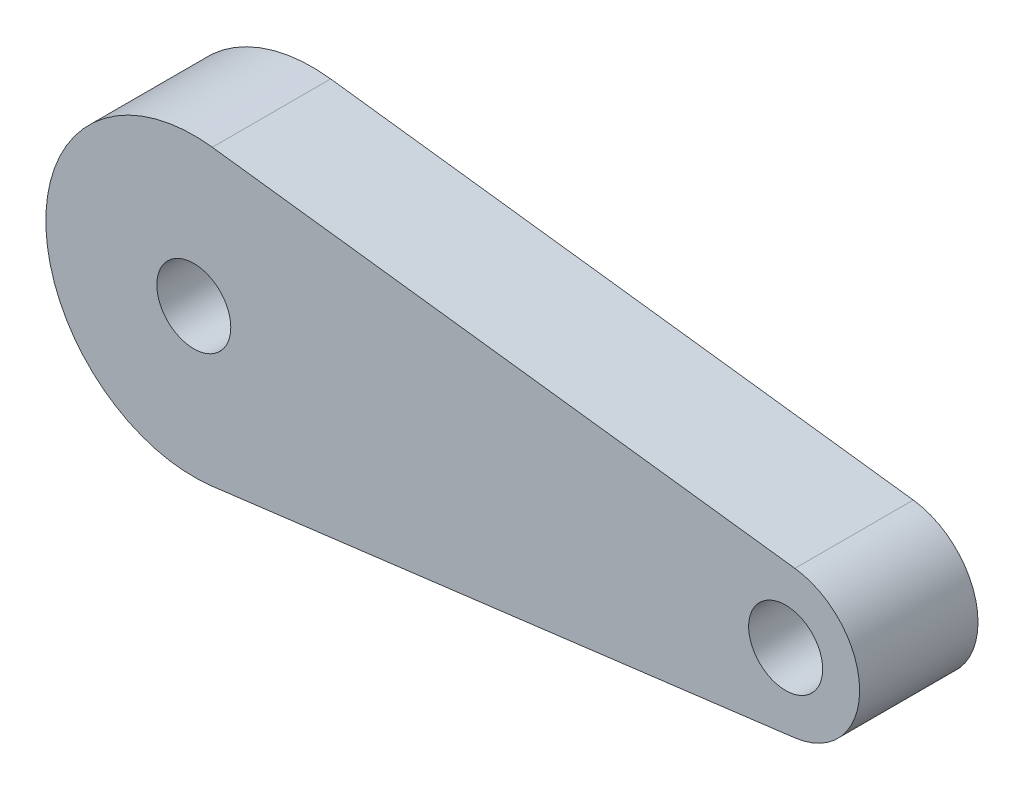
ISO-10303-21;
HEADER;
FILE_DESCRIPTION(('STEP AP214'),'2;1');
FILE_NAME('part.step','',(''),(''),'','','');
FILE_SCHEMA(('AUTOMOTIVE_DESIGN { 1 0 10303 214 1 1 1 1 }'));
ENDSEC;
DATA;
#1=APPLICATION_CONTEXT('core data for automotive mechanical design processes');
#2=APPLICATION_PROTOCOL_DEFINITION('international standard','automotive_design',2000,#1);
#3=PRODUCT_CONTEXT('',#1,'mechanical');
#4=PRODUCT('Part','Part','',(#3));
#5=PRODUCT_RELATED_PRODUCT_CATEGORY('part','',(#4));
#6=PRODUCT_DEFINITION_FORMATION('','',#4);
#7=PRODUCT_DEFINITION_CONTEXT('part definition',#1,'design');
#8=PRODUCT_DEFINITION('design','',#6,#7);
#9=PRODUCT_DEFINITION_SHAPE('','',#8);
#10=(LENGTH_UNIT() NAMED_UNIT(*) SI_UNIT(.MILLI.,.METRE.));
#11=(NAMED_UNIT(*) PLANE_ANGLE_UNIT() SI_UNIT($,.RADIAN.));
#12=(NAMED_UNIT(*) SI_UNIT($,.STERADIAN.) SOLID_ANGLE_UNIT());
#13=UNCERTAINTY_MEASURE_WITH_UNIT(LENGTH_MEASURE(1.E-05),#10,'distance_accuracy_value','');
#14=(GEOMETRIC_REPRESENTATION_CONTEXT(3) GLOBAL_UNCERTAINTY_ASSIGNED_CONTEXT((#13)) GLOBAL_UNIT_ASSIGNED_CONTEXT((#10,
#11,#12)) REPRESENTATION_CONTEXT('',''));
#15=CARTESIAN_POINT('',(0.,0.,0.));
#16=DIRECTION('',(0.,0.,1.));
#17=DIRECTION('',(1.,0.,0.));
#18=AXIS2_PLACEMENT_3D('',#15,#16,#17);
#19=CARTESIAN_POINT('',(1.25,-9.92156741649222,8.));
#20=DIRECTION('',(-0.125,0.992156741649222,0.));
#21=DIRECTION('',(-0.992156741649222,-0.125,0.));
#22=AXIS2_PLACEMENT_3D('',#19,#20,#21);
#23=PLANE('',#22);
#24=DIRECTION('',(0.992156741649222,0.125,0.));
#25=VECTOR('',#24,1.);
#26=CARTESIAN_POINT('',(1.25,-9.92156741649222,0.));
#27=LINE('',#26,#25);
#28=CARTESIAN_POINT('',(1.25,-9.92156741649221,0.));
#29=VERTEX_POINT('',#28);
#30=CARTESIAN_POINT('',(40.625,-4.96078370824611,0.));
#31=VERTEX_POINT('',#30);
#32=EDGE_CURVE('E113',#29,#31,#27,.T.);
#33=ORIENTED_EDGE('',*,*,#32,.T.);
#34=DIRECTION('',(0.,0.,-1.));
#35=VECTOR('',#34,1.);
#36=CARTESIAN_POINT('',(40.625,-4.96078370824611,8.));
#37=LINE('',#36,#35);
#38=CARTESIAN_POINT('',(40.625,-4.96078370824611,8.));
#39=VERTEX_POINT('',#38);
#40=EDGE_CURVE('E11',#39,#31,#37,.T.);
#41=ORIENTED_EDGE('',*,*,#40,.F.);
#42=DIRECTION('',(0.992156741649222,0.125,0.));
#43=VECTOR('',#42,1.);
#44=CARTESIAN_POINT('',(1.25,-9.92156741649222,8.));
#45=LINE('',#44,#43);
#46=CARTESIAN_POINT('',(1.25,-9.92156741649221,8.));
#47=VERTEX_POINT('',#46);
#48=EDGE_CURVE('E92',#47,#39,#45,.T.);
#49=ORIENTED_EDGE('',*,*,#48,.F.);
#50=DIRECTION('',(0.,0.,-1.));
#51=VECTOR('',#50,1.);
#52=CARTESIAN_POINT('',(1.25,-9.92156741649221,8.));
#53=LINE('',#52,#51);
#54=EDGE_CURVE('E109',#47,#29,#53,.T.);
#55=ORIENTED_EDGE('',*,*,#54,.T.);
#56=EDGE_LOOP('',(#33,#41,#49,#55));
#57=FACE_BOUND('',#56,.T.);
#58=ADVANCED_FACE('F43',(#57),#23,.F.);
#59=CARTESIAN_POINT('',(40.,0.,8.));
#60=DIRECTION('',(0.,0.,-1.));
#61=DIRECTION('',(-1.,0.,0.));
#62=AXIS2_PLACEMENT_3D('',#59,#60,#61);
#63=CYLINDRICAL_SURFACE('',#62,5.);
#64=CARTESIAN_POINT('',(40.,0.,0.));
#65=DIRECTION('',(0.,0.,1.));
#66=DIRECTION('',(1.,0.,0.));
#67=AXIS2_PLACEMENT_3D('',#64,#65,#66);
#68=CIRCLE('',#67,5.);
#69=CARTESIAN_POINT('',(40.625,4.96078370824611,0.));
#70=VERTEX_POINT('',#69);
#71=EDGE_CURVE('E97',#31,#70,#68,.T.);
#72=ORIENTED_EDGE('',*,*,#71,.T.);
#73=DIRECTION('',(0.,0.,-1.));
#74=VECTOR('',#73,1.);
#75=CARTESIAN_POINT('',(40.625,4.96078370824611,8.));
#76=LINE('',#75,#74);
#77=CARTESIAN_POINT('',(40.625,4.96078370824611,8.));
#78=VERTEX_POINT('',#77);
#79=EDGE_CURVE('E52',#78,#70,#76,.T.);
#80=ORIENTED_EDGE('',*,*,#79,.F.);
#81=CARTESIAN_POINT('',(40.,0.,8.));
#82=DIRECTION('',(0.,0.,1.));
#83=DIRECTION('',(1.,0.,0.));
#84=AXIS2_PLACEMENT_3D('',#81,#82,#83);
#85=CIRCLE('',#84,5.);
#86=EDGE_CURVE('E86',#39,#78,#85,.T.);
#87=ORIENTED_EDGE('',*,*,#86,.F.);
#88=ORIENTED_EDGE('',*,*,#40,.T.);
#89=EDGE_LOOP('',(#72,#80,#87,#88));
#90=FACE_BOUND('',#89,.T.);
#91=ADVANCED_FACE('F96',(#90),#63,.T.);
#92=CARTESIAN_POINT('',(1.25,9.92156741649222,8.));
#93=DIRECTION('',(0.125,0.992156741649222,0.));
#94=DIRECTION('',(-0.992156741649222,0.125,0.));
#95=AXIS2_PLACEMENT_3D('',#92,#93,#94);
#96=PLANE('',#95);
#97=DIRECTION('',(0.992156741649222,-0.125,0.));
#98=VECTOR('',#97,1.);
#99=CARTESIAN_POINT('',(1.25,9.92156741649222,0.));
#100=LINE('',#99,#98);
#101=CARTESIAN_POINT('',(1.25,9.92156741649221,0.));
#102=VERTEX_POINT('',#101);
#103=EDGE_CURVE('E117',#102,#70,#100,.T.);
#104=ORIENTED_EDGE('',*,*,#103,.F.);
#105=DIRECTION('',(0.,0.,-1.));
#106=VECTOR('',#105,1.);
#107=CARTESIAN_POINT('',(1.25,9.92156741649221,8.));
#108=LINE('',#107,#106);
#109=CARTESIAN_POINT('',(1.25,9.92156741649221,8.));
#110=VERTEX_POINT('',#109);
#111=EDGE_CURVE('E76',#110,#102,#108,.T.);
#112=ORIENTED_EDGE('',*,*,#111,.F.);
#113=DIRECTION('',(0.992156741649222,-0.125,0.));
#114=VECTOR('',#113,1.);
#115=CARTESIAN_POINT('',(1.25,9.92156741649222,8.));
#116=LINE('',#115,#114);
#117=EDGE_CURVE('E90',#110,#78,#116,.T.);
#118=ORIENTED_EDGE('',*,*,#117,.T.);
#119=ORIENTED_EDGE('',*,*,#79,.T.);
#120=EDGE_LOOP('',(#104,#112,#118,#119));
#121=FACE_BOUND('',#120,.T.);
#122=ADVANCED_FACE('F101',(#121),#96,.T.);
#123=CARTESIAN_POINT('',(0.,0.,8.));
#124=DIRECTION('',(0.,0.,-1.));
#125=DIRECTION('',(-1.,0.,0.));
#126=AXIS2_PLACEMENT_3D('',#123,#124,#125);
#127=CYLINDRICAL_SURFACE('',#126,10.);
#128=CARTESIAN_POINT('',(0.,0.,0.));
#129=DIRECTION('',(0.,0.,1.));
#130=DIRECTION('',(1.,0.,0.));
#131=AXIS2_PLACEMENT_3D('',#128,#129,#130);
#132=CIRCLE('',#131,10.);
#133=EDGE_CURVE('E79',#102,#29,#132,.T.);
#134=ORIENTED_EDGE('',*,*,#133,.T.);
#135=ORIENTED_EDGE('',*,*,#54,.F.);
#136=CARTESIAN_POINT('',(0.,0.,8.));
#137=DIRECTION('',(0.,0.,1.));
#138=DIRECTION('',(1.,0.,0.));
#139=AXIS2_PLACEMENT_3D('',#136,#137,#138);
#140=CIRCLE('',#139,10.);
#141=EDGE_CURVE('E60',#110,#47,#140,.T.);
#142=ORIENTED_EDGE('',*,*,#141,.F.);
#143=ORIENTED_EDGE('',*,*,#111,.T.);
#144=EDGE_LOOP('',(#134,#135,#142,#143));
#145=FACE_BOUND('',#144,.T.);
#146=ADVANCED_FACE('F145',(#145),#127,.T.);
#147=CARTESIAN_POINT('',(40.,0.,8.));
#148=DIRECTION('',(0.,0.,-1.));
#149=DIRECTION('',(-1.,0.,0.));
#150=AXIS2_PLACEMENT_3D('',#147,#148,#149);
#151=CYLINDRICAL_SURFACE('',#150,2.5);
#152=CARTESIAN_POINT('',(40.,0.,8.));
#153=DIRECTION('',(0.,0.,1.));
#154=DIRECTION('',(1.,0.,0.));
#155=AXIS2_PLACEMENT_3D('',#152,#153,#154);
#156=CIRCLE('',#155,2.5);
#157=CARTESIAN_POINT('',(42.5,0.,8.));
#158=VERTEX_POINT('',#157);
#159=EDGE_CURVE('E123',#158,#158,#156,.T.);
#160=ORIENTED_EDGE('',*,*,#159,.T.);
#161=EDGE_LOOP('',(#160));
#162=FACE_BOUND('',#161,.T.);
#163=CARTESIAN_POINT('',(40.,0.,0.));
#164=DIRECTION('',(0.,0.,1.));
#165=DIRECTION('',(1.,0.,0.));
#166=AXIS2_PLACEMENT_3D('',#163,#164,#165);
#167=CIRCLE('',#166,2.5);
#168=CARTESIAN_POINT('',(42.5,0.,0.));
#169=VERTEX_POINT('',#168);
#170=EDGE_CURVE('E110',#169,#169,#167,.T.);
#171=ORIENTED_EDGE('',*,*,#170,.F.);
#172=EDGE_LOOP('',(#171));
#173=FACE_BOUND('',#172,.T.);
#174=ADVANCED_FACE('F45',(#162,#173),#151,.F.);
#175=CARTESIAN_POINT('',(0.,0.,8.));
#176=DIRECTION('',(0.,0.,-1.));
#177=DIRECTION('',(-1.,0.,0.));
#178=AXIS2_PLACEMENT_3D('',#175,#176,#177);
#179=CYLINDRICAL_SURFACE('',#178,2.5);
#180=CARTESIAN_POINT('',(0.,0.,8.));
#181=DIRECTION('',(0.,0.,1.));
#182=DIRECTION('',(1.,0.,0.));
#183=AXIS2_PLACEMENT_3D('',#180,#181,#182);
#184=CIRCLE('',#183,2.5);
#185=CARTESIAN_POINT('',(2.5,0.,8.));
#186=VERTEX_POINT('',#185);
#187=EDGE_CURVE('E103',#186,#186,#184,.T.);
#188=ORIENTED_EDGE('',*,*,#187,.T.);
#189=EDGE_LOOP('',(#188));
#190=FACE_BOUND('',#189,.T.);
#191=CARTESIAN_POINT('',(0.,0.,0.));
#192=DIRECTION('',(0.,0.,1.));
#193=DIRECTION('',(1.,0.,0.));
#194=AXIS2_PLACEMENT_3D('',#191,#192,#193);
#195=CIRCLE('',#194,2.5);
#196=CARTESIAN_POINT('',(2.5,0.,0.));
#197=VERTEX_POINT('',#196);
#198=EDGE_CURVE('E120',#197,#197,#195,.T.);
#199=ORIENTED_EDGE('',*,*,#198,.F.);
#200=EDGE_LOOP('',(#199));
#201=FACE_BOUND('',#200,.T.);
#202=ADVANCED_FACE('F135',(#190,#201),#179,.F.);
#203=CARTESIAN_POINT('',(0.,0.,8.));
#204=DIRECTION('',(0.,0.,1.));
#205=DIRECTION('',(1.,0.,0.));
#206=AXIS2_PLACEMENT_3D('',#203,#204,#205);
#207=PLANE('',#206);
#208=ORIENTED_EDGE('',*,*,#159,.F.);
#209=EDGE_LOOP('',(#208));
#210=FACE_BOUND('',#209,.T.);
#211=ORIENTED_EDGE('',*,*,#48,.T.);
#212=ORIENTED_EDGE('',*,*,#86,.T.);
#213=ORIENTED_EDGE('',*,*,#117,.F.);
#214=ORIENTED_EDGE('',*,*,#141,.T.);
#215=EDGE_LOOP('',(#211,#212,#213,#214));
#216=FACE_BOUND('',#215,.T.);
#217=ORIENTED_EDGE('',*,*,#187,.F.);
#218=EDGE_LOOP('',(#217));
#219=FACE_BOUND('',#218,.T.);
#220=ADVANCED_FACE('F87',(#210,#216,#219),#207,.T.);
#221=CARTESIAN_POINT('',(0.,0.,0.));
#222=DIRECTION('',(0.,0.,1.));
#223=DIRECTION('',(1.,0.,0.));
#224=AXIS2_PLACEMENT_3D('',#221,#222,#223);
#225=PLANE('',#224);
#226=ORIENTED_EDGE('',*,*,#170,.T.);
#227=EDGE_LOOP('',(#226));
#228=FACE_BOUND('',#227,.T.);
#229=ORIENTED_EDGE('',*,*,#32,.F.);
#230=ORIENTED_EDGE('',*,*,#133,.F.);
#231=ORIENTED_EDGE('',*,*,#103,.T.);
#232=ORIENTED_EDGE('',*,*,#71,.F.);
#233=EDGE_LOOP('',(#229,#230,#231,#232));
#234=FACE_BOUND('',#233,.T.);
#235=ORIENTED_EDGE('',*,*,#198,.T.);
#236=EDGE_LOOP('',(#235));
#237=FACE_BOUND('',#236,.T.);
#238=ADVANCED_FACE('F128',(#228,#234,#237),#225,.F.);
#239=CLOSED_SHELL('',(#58,#91,#122,#146,#174,#202,#220,#238));
#240=MANIFOLD_SOLID_BREP('B2',#239);
#241=ADVANCED_BREP_SHAPE_REPRESENTATION('',(#18,#240),#14);
#242=SHAPE_DEFINITION_REPRESENTATION(#9,#241);
ENDSEC;
END-ISO-10303-21;
